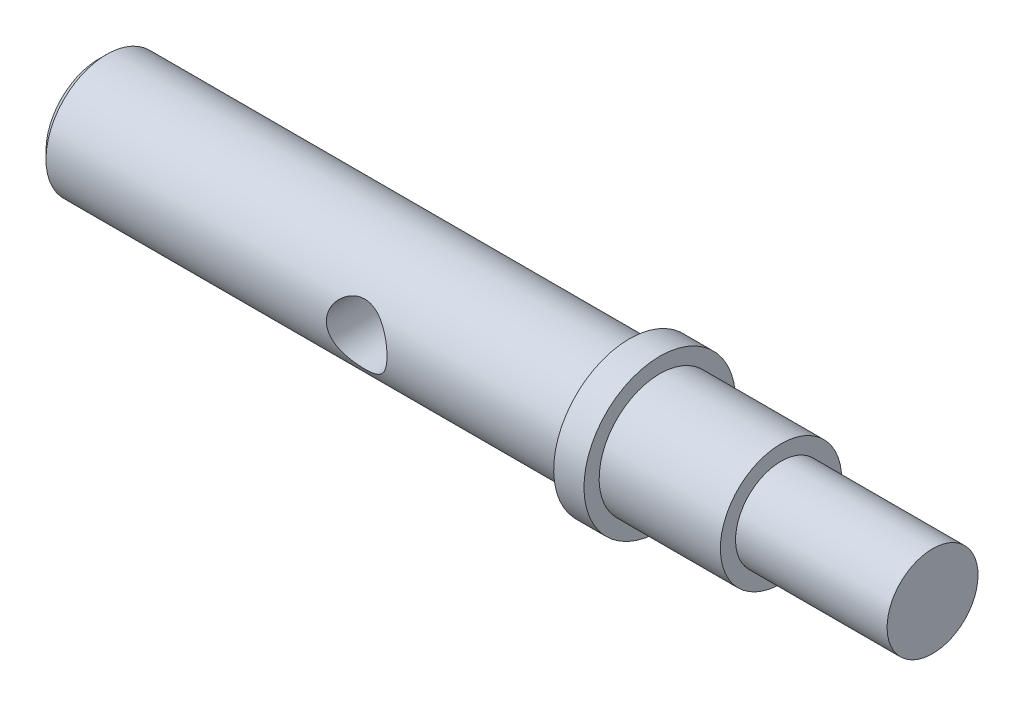
ISO-10303-21;
HEADER;
FILE_DESCRIPTION(('STEP AP214'),'2;1');
FILE_NAME('part.step','',(''),(''),'','','');
FILE_SCHEMA(('AUTOMOTIVE_DESIGN { 1 0 10303 214 1 1 1 1 }'));
ENDSEC;
DATA;
#1=APPLICATION_CONTEXT('core data for automotive mechanical design processes');
#2=APPLICATION_PROTOCOL_DEFINITION('international standard','automotive_design',2000,#1);
#3=PRODUCT_CONTEXT('',#1,'mechanical');
#4=PRODUCT('Part','Part','',(#3));
#5=PRODUCT_RELATED_PRODUCT_CATEGORY('part','',(#4));
#6=PRODUCT_DEFINITION_FORMATION('','',#4);
#7=PRODUCT_DEFINITION_CONTEXT('part definition',#1,'design');
#8=PRODUCT_DEFINITION('design','',#6,#7);
#9=PRODUCT_DEFINITION_SHAPE('','',#8);
#10=(LENGTH_UNIT() NAMED_UNIT(*) SI_UNIT(.MILLI.,.METRE.));
#11=(NAMED_UNIT(*) PLANE_ANGLE_UNIT() SI_UNIT($,.RADIAN.));
#12=(NAMED_UNIT(*) SI_UNIT($,.STERADIAN.) SOLID_ANGLE_UNIT());
#13=UNCERTAINTY_MEASURE_WITH_UNIT(LENGTH_MEASURE(1.E-05),#10,'distance_accuracy_value','');
#14=(GEOMETRIC_REPRESENTATION_CONTEXT(3) GLOBAL_UNCERTAINTY_ASSIGNED_CONTEXT((#13)) GLOBAL_UNIT_ASSIGNED_CONTEXT((#10,
#11,#12)) REPRESENTATION_CONTEXT('',''));
#15=CARTESIAN_POINT('',(0.,0.,0.));
#16=DIRECTION('',(0.,0.,1.));
#17=DIRECTION('',(1.,0.,0.));
#18=AXIS2_PLACEMENT_3D('',#15,#16,#17);
#19=CARTESIAN_POINT('',(-16.7017543859649,0.,0.));
#20=DIRECTION('',(-1.,0.,0.));
#21=DIRECTION('',(0.,-1.,0.));
#22=AXIS2_PLACEMENT_3D('',#19,#20,#21);
#23=CYLINDRICAL_SURFACE('',#22,2.);
#24=CARTESIAN_POINT('',(0.250000000000007,0.,0.));
#25=DIRECTION('',(-1.,0.,0.));
#26=DIRECTION('',(0.,-1.,0.));
#27=AXIS2_PLACEMENT_3D('',#24,#25,#26);
#28=CIRCLE('',#27,2.);
#29=CARTESIAN_POINT('',(0.250000000000007,-2.,0.));
#30=VERTEX_POINT('',#29);
#31=EDGE_CURVE('E46',#30,#30,#28,.F.);
#32=ORIENTED_EDGE('',*,*,#31,.T.);
#33=EDGE_LOOP('',(#32));
#34=FACE_BOUND('',#33,.T.);
#35=CARTESIAN_POINT('',(11.5,0.,-2.));
#36=CARTESIAN_POINT('',(11.4999966976805,-0.0525719629529866,-1.99999713404151));
#37=CARTESIAN_POINT('',(11.4958299268783,-0.105206599698033,-1.99790491019518));
#38=CARTESIAN_POINT('',(11.4793471196591,-0.208920235268425,-1.98974156037396));
#39=CARTESIAN_POINT('',(11.4670156070024,-0.259996086713504,-1.98366287828984));
#40=CARTESIAN_POINT('',(11.4348061913832,-0.358933544880574,-1.96816279403312));
#41=CARTESIAN_POINT('',(11.414957615752,-0.40680680293918,-1.9587543917752));
#42=CARTESIAN_POINT('',(11.3684293786351,-0.498472616806565,-1.93745776515779));
#43=CARTESIAN_POINT('',(11.3417502557511,-0.54226549399005,-1.9255697363353));
#44=CARTESIAN_POINT('',(11.2804827505147,-0.62750781776192,-1.89956258258057));
#45=CARTESIAN_POINT('',(11.2455135207604,-0.668655211122113,-1.88535199127536));
#46=CARTESIAN_POINT('',(11.169478520753,-0.744779444866978,-1.85659970246744));
#47=CARTESIAN_POINT('',(11.1284081482276,-0.779751583106767,-1.84205776209035));
#48=CARTESIAN_POINT('',(11.0375166504766,-0.845252000450279,-1.81298951197347));
#49=CARTESIAN_POINT('',(10.9872639016541,-0.875225335551638,-1.79855186970132));
#50=CARTESIAN_POINT('',(10.8816326640138,-0.926168226890696,-1.77285978772321));
#51=CARTESIAN_POINT('',(10.8262578712773,-0.947144214966335,-1.7616030760699));
#52=CARTESIAN_POINT('',(10.7153348945781,-0.97813244218859,-1.74457867037808));
#53=CARTESIAN_POINT('',(10.6599955479326,-0.988725857080443,-1.73852271583714));
#54=CARTESIAN_POINT('',(10.5480211622205,-1.00042699330885,-1.73181889948528));
#55=CARTESIAN_POINT('',(10.4913874591288,-1.00154408837308,-1.73116569343288));
#56=CARTESIAN_POINT('',(10.3857139756846,-0.994687287172296,-1.73510930257248));
#57=CARTESIAN_POINT('',(10.3365759687769,-0.987784559536823,-1.73908763662014));
#58=CARTESIAN_POINT('',(10.240278090627,-0.966939849056934,-1.7507622873385));
#59=CARTESIAN_POINT('',(10.1931188546947,-0.952995623897653,-1.75845978831776));
#60=CARTESIAN_POINT('',(10.1007708674343,-0.918209780386005,-1.77687476412741));
#61=CARTESIAN_POINT('',(10.0556536012142,-0.897215067115996,-1.78765840663998));
#62=CARTESIAN_POINT('',(9.96936570740999,-0.849041687668004,-1.81103404281404));
#63=CARTESIAN_POINT('',(9.92819686439991,-0.821860243812469,-1.82362684780191));
#64=CARTESIAN_POINT('',(9.84547874725677,-0.75806605491279,-1.85113157903286));
#65=CARTESIAN_POINT('',(9.80454312642384,-0.720694458369283,-1.86613510236746));
#66=CARTESIAN_POINT('',(9.7292645814091,-0.639555578741375,-1.89547623300407));
#67=CARTESIAN_POINT('',(9.69492480796611,-0.595785256574287,-1.90981351958801));
#68=CARTESIAN_POINT('',(9.63231433897027,-0.50051650583185,-1.93701987282964));
#69=CARTESIAN_POINT('',(9.60439952755426,-0.44875359159941,-1.94978984162007));
#70=CARTESIAN_POINT('',(9.55790297095699,-0.340466215488798,-1.97157881121242));
#71=CARTESIAN_POINT('',(9.53931381498483,-0.283945576265278,-1.98060078943553));
#72=CARTESIAN_POINT('',(9.51352459628332,-0.172766491660703,-1.99324333741436));
#73=CARTESIAN_POINT('',(9.50550876425322,-0.118341530548326,-1.99724938301312));
#74=CARTESIAN_POINT('',(9.49853526886551,-0.008779599949355,-2.00073013459102));
#75=CARTESIAN_POINT('',(9.49957331436052,0.0463570198699002,-2.00020698721312));
#76=CARTESIAN_POINT('',(9.51020668841875,0.151232971985993,-1.99491192253441));
#77=CARTESIAN_POINT('',(9.51913253273003,0.201059408049953,-1.9904724568819));
#78=CARTESIAN_POINT('',(9.54423807189508,0.298406892301916,-1.97822171314819));
#79=CARTESIAN_POINT('',(9.56041856645336,0.345927685690996,-1.97041006334333));
#80=CARTESIAN_POINT('',(9.59999846643317,0.438888608449665,-1.9518425141367));
#81=CARTESIAN_POINT('',(9.62359105011681,0.484230397006154,-1.94100881769939));
#82=CARTESIAN_POINT('',(9.67710753564604,0.570461361698921,-1.91743974317109));
#83=CARTESIAN_POINT('',(9.70703413459343,0.611348629775282,-1.90470355565785));
#84=CARTESIAN_POINT('',(9.77576042533287,0.691767689290654,-1.87708221337464));
#85=CARTESIAN_POINT('',(9.81514286845356,0.730772077824639,-1.86210884848441));
#86=CARTESIAN_POINT('',(9.8999251512693,0.80185632111324,-1.83262391603874));
#87=CARTESIAN_POINT('',(9.94532911881637,0.833931385690841,-1.81811267381526));
#88=CARTESIAN_POINT('',(10.0436436542003,0.891707914497696,-1.79051192226068));
#89=CARTESIAN_POINT('',(10.0968112662086,0.917025495878638,-1.77752529663472));
#90=CARTESIAN_POINT('',(10.2075100676925,0.958082826013804,-1.75574072368126));
#91=CARTESIAN_POINT('',(10.2650355265012,0.973834915887571,-1.74693738240618));
#92=CARTESIAN_POINT('',(10.3769102228614,0.993861687449681,-1.73561501008667));
#93=CARTESIAN_POINT('',(10.431034253429,0.999092996400866,-1.73257383460491));
#94=CARTESIAN_POINT('',(10.5394470671707,1.00068915438079,-1.73165354646175));
#95=CARTESIAN_POINT('',(10.5937357687394,0.9970578466244,-1.73377219627553));
#96=CARTESIAN_POINT('',(10.695483501532,0.981926125592265,-1.74237862050025));
#97=CARTESIAN_POINT('',(10.7431004701444,0.971208314342801,-1.74843094482394));
#98=CARTESIAN_POINT('',(10.8358081194247,0.943175358224647,-1.76371016187917));
#99=CARTESIAN_POINT('',(10.880897982092,0.925858091159813,-1.77293807569675));
#100=CARTESIAN_POINT('',(10.9706248509866,0.883815745300685,-1.79428530364528));
#101=CARTESIAN_POINT('',(11.0150279018297,0.85867113781646,-1.80655722396191));
#102=CARTESIAN_POINT('',(11.0992745361806,0.802150971636636,-1.8323533163459));
#103=CARTESIAN_POINT('',(11.1391157305185,0.77077217123865,-1.84587813794522));
#104=CARTESIAN_POINT('',(11.2181419823576,0.698203326664643,-1.87462323159313));
#105=CARTESIAN_POINT('',(11.2566591023619,0.656284423010173,-1.88984983311469));
#106=CARTESIAN_POINT('',(11.3262629834236,0.566154806220281,-1.91877752255088));
#107=CARTESIAN_POINT('',(11.3573457394263,0.517940723256786,-1.9324777860804));
#108=CARTESIAN_POINT('',(11.4112363627622,0.415931596819948,-1.95698009585103));
#109=CARTESIAN_POINT('',(11.4339841694114,0.362099503934616,-1.96776096562909));
#110=CARTESIAN_POINT('',(11.469808167919,0.250742101294193,-1.98501341363465));
#111=CARTESIAN_POINT('',(11.4829118468296,0.193227799623168,-1.99149723372932));
#112=CARTESIAN_POINT('',(11.4938974110758,0.112601946483385,-1.99695461909663));
#113=CARTESIAN_POINT('',(11.4961826408636,0.0901618794395,-1.99809365339202));
#114=CARTESIAN_POINT('',(11.4992346655168,0.0451517318071585,-1.99961696977865));
#115=CARTESIAN_POINT('',(11.5000014184712,0.0225816476473818,-2.00000123103763));
#116=CARTESIAN_POINT('',(11.5,0.,-2.));
#117=B_SPLINE_CURVE_WITH_KNOTS('',3,(#35,#36,#37,#38,#39,#40,#41,#42,#43,#44,#45,#46,#47,#48,
#49,#50,#51,#52,#53,#54,#55,#56,#57,#58,#59,#60,#61,#62,#63,#64,#65,#66,#67,#68,#69,#70,#71,#72,
#73,#74,#75,#76,#77,#78,#79,#80,#81,#82,#83,#84,#85,#86,#87,#88,#89,#90,#91,#92,#93,#94,#95,#96,
#97,#98,#99,#100,#101,#102,#103,#104,#105,#106,#107,#108,#109,#110,#111,#112,#113,#114,#115,
#116),.UNSPECIFIED.,.T.,.F.,(4,2,2,2,2,2,2,2,2,2,2,2,2,2,2,2,2,2,2,2,2,2,2,2,2,2,2,2,2,2,2,2,2,
2,2,2,2,2,2,2,4),(0.,0.157624257420293,0.315548149709198,0.472862155492298,0.630163760581568,
0.79698175871809,0.963926237654036,1.14381726430753,1.32357947898281,1.4925801214023,
1.66141357329021,1.81005712409321,1.95874803925679,2.11090240168488,2.26312521260222,
2.43464941333879,2.60625534598687,2.78583022214441,2.9652621691228,3.12983290471346,
3.29432564511476,3.44606906506122,3.59782921630932,3.75392856027899,3.9100945074834,
4.08159610644419,4.25321588615432,4.43314682159675,4.61284511940778,4.77529307498374,
4.93767059860006,5.08457930244183,5.23153528783679,5.38836456775615,5.54527561138959,
5.72125242752499,5.89732383376574,6.07464013662926,6.25144908624931,6.31915280137699,
6.38685838514848),.UNSPECIFIED.);
#118=CARTESIAN_POINT('',(11.5,0.,-2.));
#119=VERTEX_POINT('',#118);
#120=EDGE_CURVE('E77',#119,#119,#117,.T.);
#121=ORIENTED_EDGE('',*,*,#120,.F.);
#122=EDGE_LOOP('',(#121));
#123=FACE_BOUND('',#122,.T.);
#124=CARTESIAN_POINT('',(11.5,0.,2.));
#125=CARTESIAN_POINT('',(11.4999966976805,0.0525719629529866,1.99999713404151));
#126=CARTESIAN_POINT('',(11.4958299268783,0.105206599698033,1.99790491019518));
#127=CARTESIAN_POINT('',(11.4793471196591,0.208920235268425,1.98974156037396));
#128=CARTESIAN_POINT('',(11.4670156070024,0.259996086713504,1.98366287828984));
#129=CARTESIAN_POINT('',(11.4348061913832,0.358933544880574,1.96816279403312));
#130=CARTESIAN_POINT('',(11.414957615752,0.40680680293918,1.9587543917752));
#131=CARTESIAN_POINT('',(11.3684293786351,0.498472616806565,1.93745776515779));
#132=CARTESIAN_POINT('',(11.3417502557511,0.54226549399005,1.9255697363353));
#133=CARTESIAN_POINT('',(11.2804827505147,0.62750781776192,1.89956258258057));
#134=CARTESIAN_POINT('',(11.2455135207604,0.668655211122113,1.88535199127536));
#135=CARTESIAN_POINT('',(11.169478520753,0.744779444866978,1.85659970246744));
#136=CARTESIAN_POINT('',(11.1284081482276,0.779751583106767,1.84205776209035));
#137=CARTESIAN_POINT('',(11.0375166504766,0.845252000450279,1.81298951197347));
#138=CARTESIAN_POINT('',(10.9872639016541,0.875225335551638,1.79855186970132));
#139=CARTESIAN_POINT('',(10.8816326640138,0.926168226890696,1.77285978772321));
#140=CARTESIAN_POINT('',(10.8262578712773,0.947144214966335,1.7616030760699));
#141=CARTESIAN_POINT('',(10.7153348945781,0.97813244218859,1.74457867037808));
#142=CARTESIAN_POINT('',(10.6599955479326,0.988725857080443,1.73852271583714));
#143=CARTESIAN_POINT('',(10.5480211622205,1.00042699330885,1.73181889948528));
#144=CARTESIAN_POINT('',(10.4913874591288,1.00154408837308,1.73116569343288));
#145=CARTESIAN_POINT('',(10.3857139756846,0.994687287172296,1.73510930257248));
#146=CARTESIAN_POINT('',(10.3365759687769,0.987784559536823,1.73908763662014));
#147=CARTESIAN_POINT('',(10.240278090627,0.966939849056934,1.7507622873385));
#148=CARTESIAN_POINT('',(10.1931188546947,0.952995623897653,1.75845978831776));
#149=CARTESIAN_POINT('',(10.1007708674343,0.918209780386005,1.77687476412741));
#150=CARTESIAN_POINT('',(10.0556536012142,0.897215067115996,1.78765840663998));
#151=CARTESIAN_POINT('',(9.96936570740999,0.849041687668004,1.81103404281404));
#152=CARTESIAN_POINT('',(9.92819686439991,0.821860243812469,1.82362684780191));
#153=CARTESIAN_POINT('',(9.84547874725677,0.75806605491279,1.85113157903286));
#154=CARTESIAN_POINT('',(9.80454312642384,0.720694458369283,1.86613510236746));
#155=CARTESIAN_POINT('',(9.7292645814091,0.639555578741375,1.89547623300407));
#156=CARTESIAN_POINT('',(9.69492480796611,0.595785256574287,1.90981351958801));
#157=CARTESIAN_POINT('',(9.63231433897027,0.50051650583185,1.93701987282964));
#158=CARTESIAN_POINT('',(9.60439952755426,0.44875359159941,1.94978984162007));
#159=CARTESIAN_POINT('',(9.55790297095699,0.340466215488798,1.97157881121242));
#160=CARTESIAN_POINT('',(9.53931381498483,0.283945576265278,1.98060078943553));
#161=CARTESIAN_POINT('',(9.51352459628332,0.172766491660703,1.99324333741436));
#162=CARTESIAN_POINT('',(9.50550876425322,0.118341530548326,1.99724938301312));
#163=CARTESIAN_POINT('',(9.49853526886551,0.008779599949355,2.00073013459102));
#164=CARTESIAN_POINT('',(9.49957331436052,-0.0463570198699002,2.00020698721312));
#165=CARTESIAN_POINT('',(9.51020668841875,-0.151232971985993,1.99491192253441));
#166=CARTESIAN_POINT('',(9.51913253273003,-0.201059408049953,1.9904724568819));
#167=CARTESIAN_POINT('',(9.54423807189508,-0.298406892301916,1.97822171314819));
#168=CARTESIAN_POINT('',(9.56041856645336,-0.345927685690996,1.97041006334333));
#169=CARTESIAN_POINT('',(9.59999846643317,-0.438888608449665,1.9518425141367));
#170=CARTESIAN_POINT('',(9.62359105011681,-0.484230397006154,1.94100881769939));
#171=CARTESIAN_POINT('',(9.67710753564604,-0.570461361698921,1.91743974317109));
#172=CARTESIAN_POINT('',(9.70703413459343,-0.611348629775282,1.90470355565785));
#173=CARTESIAN_POINT('',(9.77576042533287,-0.691767689290654,1.87708221337464));
#174=CARTESIAN_POINT('',(9.81514286845356,-0.730772077824639,1.86210884848441));
#175=CARTESIAN_POINT('',(9.8999251512693,-0.80185632111324,1.83262391603874));
#176=CARTESIAN_POINT('',(9.94532911881637,-0.833931385690841,1.81811267381526));
#177=CARTESIAN_POINT('',(10.0436436542003,-0.891707914497696,1.79051192226068));
#178=CARTESIAN_POINT('',(10.0968112662086,-0.917025495878638,1.77752529663472));
#179=CARTESIAN_POINT('',(10.2075100676925,-0.958082826013804,1.75574072368126));
#180=CARTESIAN_POINT('',(10.2650355265012,-0.973834915887571,1.74693738240618));
#181=CARTESIAN_POINT('',(10.3769102228614,-0.993861687449681,1.73561501008667));
#182=CARTESIAN_POINT('',(10.431034253429,-0.999092996400866,1.73257383460491));
#183=CARTESIAN_POINT('',(10.5394470671707,-1.00068915438079,1.73165354646175));
#184=CARTESIAN_POINT('',(10.5937357687394,-0.9970578466244,1.73377219627553));
#185=CARTESIAN_POINT('',(10.695483501532,-0.981926125592265,1.74237862050025));
#186=CARTESIAN_POINT('',(10.7431004701444,-0.971208314342801,1.74843094482394));
#187=CARTESIAN_POINT('',(10.8358081194247,-0.943175358224647,1.76371016187917));
#188=CARTESIAN_POINT('',(10.880897982092,-0.925858091159813,1.77293807569675));
#189=CARTESIAN_POINT('',(10.9706248509866,-0.883815745300685,1.79428530364528));
#190=CARTESIAN_POINT('',(11.0150279018297,-0.85867113781646,1.80655722396191));
#191=CARTESIAN_POINT('',(11.0992745361806,-0.802150971636636,1.8323533163459));
#192=CARTESIAN_POINT('',(11.1391157305185,-0.77077217123865,1.84587813794522));
#193=CARTESIAN_POINT('',(11.2181419823576,-0.698203326664643,1.87462323159313));
#194=CARTESIAN_POINT('',(11.2566591023619,-0.656284423010173,1.88984983311469));
#195=CARTESIAN_POINT('',(11.3262629834236,-0.566154806220281,1.91877752255088));
#196=CARTESIAN_POINT('',(11.3573457394263,-0.517940723256786,1.9324777860804));
#197=CARTESIAN_POINT('',(11.4112363627622,-0.415931596819948,1.95698009585103));
#198=CARTESIAN_POINT('',(11.4339841694114,-0.362099503934616,1.96776096562909));
#199=CARTESIAN_POINT('',(11.469808167919,-0.250742101294193,1.98501341363465));
#200=CARTESIAN_POINT('',(11.4829118468296,-0.193227799623168,1.99149723372932));
#201=CARTESIAN_POINT('',(11.4938974110758,-0.112601946483385,1.99695461909663));
#202=CARTESIAN_POINT('',(11.4961826408636,-0.0901618794395,1.99809365339202));
#203=CARTESIAN_POINT('',(11.4992346655168,-0.0451517318071585,1.99961696977865));
#204=CARTESIAN_POINT('',(11.5000014184712,-0.0225816476473818,2.00000123103763));
#205=CARTESIAN_POINT('',(11.5,0.,2.));
#206=B_SPLINE_CURVE_WITH_KNOTS('',3,(#124,#125,#126,#127,#128,#129,#130,#131,#132,#133,#134,
#135,#136,#137,#138,#139,#140,#141,#142,#143,#144,#145,#146,#147,#148,#149,#150,#151,#152,#153,
#154,#155,#156,#157,#158,#159,#160,#161,#162,#163,#164,#165,#166,#167,#168,#169,#170,#171,#172,
#173,#174,#175,#176,#177,#178,#179,#180,#181,#182,#183,#184,#185,#186,#187,#188,#189,#190,#191,
#192,#193,#194,#195,#196,#197,#198,#199,#200,#201,#202,#203,#204,#205),.UNSPECIFIED.,.T.,.F.,(4,
2,2,2,2,2,2,2,2,2,2,2,2,2,2,2,2,2,2,2,2,2,2,2,2,2,2,2,2,2,2,2,2,2,2,2,2,2,2,2,4),(0.,
0.157624257420293,0.315548149709198,0.472862155492298,0.630163760581568,0.79698175871809,
0.963926237654036,1.14381726430753,1.32357947898281,1.4925801214023,1.66141357329021,
1.81005712409321,1.95874803925679,2.11090240168488,2.26312521260222,2.43464941333879,
2.60625534598687,2.78583022214441,2.9652621691228,3.12983290471346,3.29432564511476,
3.44606906506122,3.59782921630932,3.75392856027899,3.9100945074834,4.08159610644419,
4.25321588615432,4.43314682159675,4.61284511940778,4.77529307498374,4.93767059860006,
5.08457930244183,5.23153528783679,5.38836456775615,5.54527561138959,5.72125242752499,
5.89732383376574,6.07464013662926,6.25144908624931,6.31915280137699,6.38685838514848),.UNSPECIFIED.);
#207=CARTESIAN_POINT('',(11.5,0.,2.));
#208=VERTEX_POINT('',#207);
#209=EDGE_CURVE('E68',#208,#208,#206,.T.);
#210=ORIENTED_EDGE('',*,*,#209,.F.);
#211=EDGE_LOOP('',(#210));
#212=FACE_BOUND('',#211,.T.);
#213=CARTESIAN_POINT('',(17.5,0.,0.));
#214=DIRECTION('',(1.,0.,0.));
#215=DIRECTION('',(0.,1.,0.));
#216=AXIS2_PLACEMENT_3D('',#213,#214,#215);
#217=CIRCLE('',#216,2.);
#218=CARTESIAN_POINT('',(17.5,2.,0.));
#219=VERTEX_POINT('',#218);
#220=EDGE_CURVE('E61',#219,#219,#217,.T.);
#221=ORIENTED_EDGE('',*,*,#220,.F.);
#222=EDGE_LOOP('',(#221));
#223=FACE_BOUND('',#222,.T.);
#224=ADVANCED_FACE('F41',(#34,#123,#212,#223),#23,.T.);
#225=CARTESIAN_POINT('',(0.,0.,0.));
#226=DIRECTION('',(-1.,0.,0.));
#227=DIRECTION('',(0.,-1.,0.));
#228=AXIS2_PLACEMENT_3D('',#225,#226,#227);
#229=PLANE('',#228);
#230=CARTESIAN_POINT('',(0.,0.,0.));
#231=DIRECTION('',(-1.,0.,0.));
#232=DIRECTION('',(0.,-1.,0.));
#233=AXIS2_PLACEMENT_3D('',#230,#231,#232);
#234=CIRCLE('',#233,1.74999999999999);
#235=CARTESIAN_POINT('',(0.,-1.74999999999999,0.));
#236=VERTEX_POINT('',#235);
#237=EDGE_CURVE('E54',#236,#236,#234,.T.);
#238=ORIENTED_EDGE('',*,*,#237,.T.);
#239=EDGE_LOOP('',(#238));
#240=FACE_BOUND('',#239,.T.);
#241=ADVANCED_FACE('F90',(#240),#229,.T.);
#242=CARTESIAN_POINT('',(10.5,0.,-5.));
#243=DIRECTION('',(0.,0.,1.));
#244=DIRECTION('',(1.,0.,0.));
#245=AXIS2_PLACEMENT_3D('',#242,#243,#244);
#246=CYLINDRICAL_SURFACE('',#245,1.);
#247=ORIENTED_EDGE('',*,*,#120,.T.);
#248=EDGE_LOOP('',(#247));
#249=FACE_BOUND('',#248,.T.);
#250=ORIENTED_EDGE('',*,*,#209,.T.);
#251=EDGE_LOOP('',(#250));
#252=FACE_BOUND('',#251,.T.);
#253=ADVANCED_FACE('F85',(#249,#252),#246,.F.);
#254=CARTESIAN_POINT('',(17.5,0.,0.));
#255=DIRECTION('',(1.,0.,0.));
#256=DIRECTION('',(0.,1.,0.));
#257=AXIS2_PLACEMENT_3D('',#254,#255,#256);
#258=CYLINDRICAL_SURFACE('',#257,2.5);
#259=CARTESIAN_POINT('',(17.5,0.,0.));
#260=DIRECTION('',(1.,0.,0.));
#261=DIRECTION('',(0.,1.,0.));
#262=AXIS2_PLACEMENT_3D('',#259,#260,#261);
#263=CIRCLE('',#262,2.5);
#264=CARTESIAN_POINT('',(17.5,2.5,0.));
#265=VERTEX_POINT('',#264);
#266=EDGE_CURVE('E65',#265,#265,#263,.T.);
#267=ORIENTED_EDGE('',*,*,#266,.T.);
#268=EDGE_LOOP('',(#267));
#269=FACE_BOUND('',#268,.T.);
#270=CARTESIAN_POINT('',(18.5,0.,0.));
#271=DIRECTION('',(1.,0.,0.));
#272=DIRECTION('',(0.,1.,0.));
#273=AXIS2_PLACEMENT_3D('',#270,#271,#272);
#274=CIRCLE('',#273,2.5);
#275=CARTESIAN_POINT('',(18.5,2.5,0.));
#276=VERTEX_POINT('',#275);
#277=EDGE_CURVE('E64',#276,#276,#274,.T.);
#278=ORIENTED_EDGE('',*,*,#277,.F.);
#279=EDGE_LOOP('',(#278));
#280=FACE_BOUND('',#279,.T.);
#281=ADVANCED_FACE('F89',(#269,#280),#258,.T.);
#282=CARTESIAN_POINT('',(17.5,0.,0.));
#283=DIRECTION('',(1.,0.,0.));
#284=DIRECTION('',(0.,1.,0.));
#285=AXIS2_PLACEMENT_3D('',#282,#283,#284);
#286=PLANE('',#285);
#287=ORIENTED_EDGE('',*,*,#220,.T.);
#288=EDGE_LOOP('',(#287));
#289=FACE_BOUND('',#288,.T.);
#290=ORIENTED_EDGE('',*,*,#266,.F.);
#291=EDGE_LOOP('',(#290));
#292=FACE_BOUND('',#291,.T.);
#293=ADVANCED_FACE('F118',(#289,#292),#286,.F.);
#294=CARTESIAN_POINT('',(18.5,0.,0.));
#295=DIRECTION('',(1.,0.,0.));
#296=DIRECTION('',(0.,1.,0.));
#297=AXIS2_PLACEMENT_3D('',#294,#295,#296);
#298=PLANE('',#297);
#299=CARTESIAN_POINT('',(18.5,0.,0.));
#300=DIRECTION('',(1.,0.,0.));
#301=DIRECTION('',(0.,1.,0.));
#302=AXIS2_PLACEMENT_3D('',#299,#300,#301);
#303=CIRCLE('',#302,2.);
#304=CARTESIAN_POINT('',(18.5,2.,0.));
#305=VERTEX_POINT('',#304);
#306=EDGE_CURVE('E105',#305,#305,#303,.F.);
#307=ORIENTED_EDGE('',*,*,#306,.T.);
#308=EDGE_LOOP('',(#307));
#309=FACE_BOUND('',#308,.T.);
#310=ORIENTED_EDGE('',*,*,#277,.T.);
#311=EDGE_LOOP('',(#310));
#312=FACE_BOUND('',#311,.T.);
#313=ADVANCED_FACE('F121',(#309,#312),#298,.T.);
#314=ORIENTED_EDGE('',*,*,#306,.F.);
#315=EDGE_LOOP('',(#314));
#316=FACE_BOUND('',#315,.T.);
#317=CARTESIAN_POINT('',(22.5,0.,0.));
#318=DIRECTION('',(1.,0.,0.));
#319=DIRECTION('',(0.,1.,0.));
#320=AXIS2_PLACEMENT_3D('',#317,#318,#319);
#321=CIRCLE('',#320,2.);
#322=CARTESIAN_POINT('',(22.5,2.,0.));
#323=VERTEX_POINT('',#322);
#324=EDGE_CURVE('E58',#323,#323,#321,.T.);
#325=ORIENTED_EDGE('',*,*,#324,.F.);
#326=EDGE_LOOP('',(#325));
#327=FACE_BOUND('',#326,.T.);
#328=ADVANCED_FACE('F82',(#316,#327),#23,.T.);
#329=CARTESIAN_POINT('',(0.,0.,0.));
#330=DIRECTION('',(1.,0.,0.));
#331=DIRECTION('',(0.,1.,0.));
#332=AXIS2_PLACEMENT_3D('',#329,#330,#331);
#333=CONICAL_SURFACE('',#332,1.74999999999999,0.785398163397446);
#334=ORIENTED_EDGE('',*,*,#31,.F.);
#335=EDGE_LOOP('',(#334));
#336=FACE_BOUND('',#335,.T.);
#337=ORIENTED_EDGE('',*,*,#237,.F.);
#338=EDGE_LOOP('',(#337));
#339=FACE_BOUND('',#338,.T.);
#340=ADVANCED_FACE('F44',(#336,#339),#333,.T.);
#341=CARTESIAN_POINT('',(22.5,0.,0.));
#342=DIRECTION('',(1.,0.,0.));
#343=DIRECTION('',(0.,1.,0.));
#344=AXIS2_PLACEMENT_3D('',#341,#342,#343);
#345=PLANE('',#344);
#346=CARTESIAN_POINT('',(22.5,0.,0.));
#347=DIRECTION('',(1.,0.,0.));
#348=DIRECTION('',(0.,1.,0.));
#349=AXIS2_PLACEMENT_3D('',#346,#347,#348);
#350=CIRCLE('',#349,1.5);
#351=CARTESIAN_POINT('',(22.5,1.5,0.));
#352=VERTEX_POINT('',#351);
#353=EDGE_CURVE('E10',#352,#352,#350,.T.);
#354=ORIENTED_EDGE('',*,*,#353,.F.);
#355=EDGE_LOOP('',(#354));
#356=FACE_BOUND('',#355,.T.);
#357=ORIENTED_EDGE('',*,*,#324,.T.);
#358=EDGE_LOOP('',(#357));
#359=FACE_BOUND('',#358,.T.);
#360=ADVANCED_FACE('F135',(#356,#359),#345,.T.);
#361=CARTESIAN_POINT('',(27.5,0.,0.));
#362=DIRECTION('',(-1.,0.,0.));
#363=DIRECTION('',(0.,-1.,0.));
#364=AXIS2_PLACEMENT_3D('',#361,#362,#363);
#365=CYLINDRICAL_SURFACE('',#364,1.5);
#366=CARTESIAN_POINT('',(27.5,0.,0.));
#367=DIRECTION('',(1.,0.,0.));
#368=DIRECTION('',(0.,1.,0.));
#369=AXIS2_PLACEMENT_3D('',#366,#367,#368);
#370=CIRCLE('',#369,1.5);
#371=CARTESIAN_POINT('',(27.5,1.5,0.));
#372=VERTEX_POINT('',#371);
#373=EDGE_CURVE('E57',#372,#372,#370,.T.);
#374=ORIENTED_EDGE('',*,*,#373,.F.);
#375=EDGE_LOOP('',(#374));
#376=FACE_BOUND('',#375,.T.);
#377=ORIENTED_EDGE('',*,*,#353,.T.);
#378=EDGE_LOOP('',(#377));
#379=FACE_BOUND('',#378,.T.);
#380=ADVANCED_FACE('F138',(#376,#379),#365,.T.);
#381=CARTESIAN_POINT('',(27.5,0.,0.));
#382=DIRECTION('',(1.,0.,0.));
#383=DIRECTION('',(0.,1.,0.));
#384=AXIS2_PLACEMENT_3D('',#381,#382,#383);
#385=PLANE('',#384);
#386=ORIENTED_EDGE('',*,*,#373,.T.);
#387=EDGE_LOOP('',(#386));
#388=FACE_BOUND('',#387,.T.);
#389=ADVANCED_FACE('F142',(#388),#385,.T.);
#390=CLOSED_SHELL('',(#224,#241,#253,#281,#293,#313,#328,#340,#360,#380,#389));
#391=MANIFOLD_SOLID_BREP('B2',#390);
#392=ADVANCED_BREP_SHAPE_REPRESENTATION('',(#18,#391),#14);
#393=SHAPE_DEFINITION_REPRESENTATION(#9,#392);
ENDSEC;
END-ISO-10303-21;
